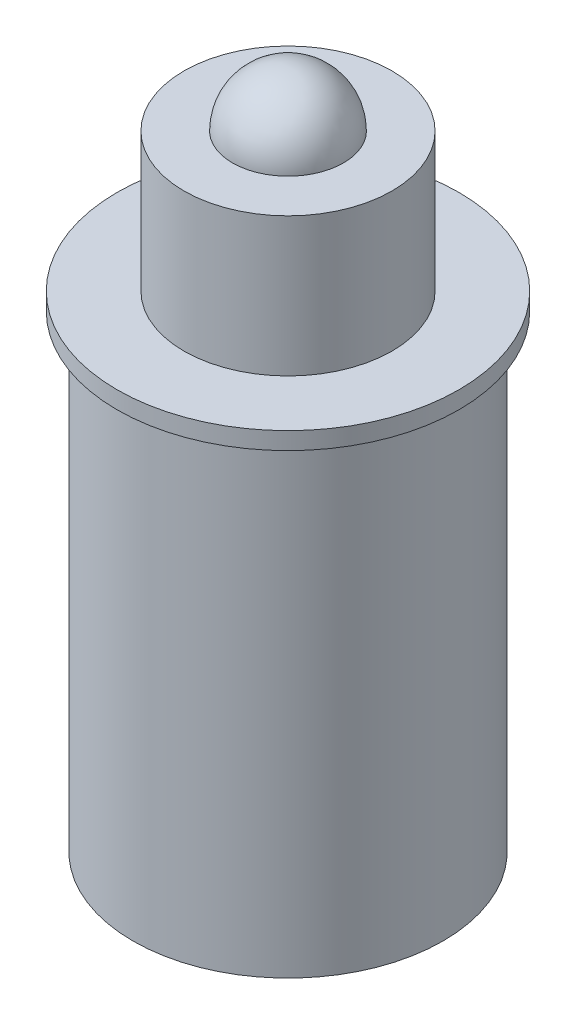
ISO-10303-21;
HEADER;
FILE_DESCRIPTION(('STEP AP214'),'2;1');
FILE_NAME('part.step','',(''),(''),'','','');
FILE_SCHEMA(('AUTOMOTIVE_DESIGN { 1 0 10303 214 1 1 1 1 }'));
ENDSEC;
DATA;
#1=APPLICATION_CONTEXT('core data for automotive mechanical design processes');
#2=APPLICATION_PROTOCOL_DEFINITION('international standard','automotive_design',2000,#1);
#3=PRODUCT_CONTEXT('',#1,'mechanical');
#4=PRODUCT('Part','Part','',(#3));
#5=PRODUCT_RELATED_PRODUCT_CATEGORY('part','',(#4));
#6=PRODUCT_DEFINITION_FORMATION('','',#4);
#7=PRODUCT_DEFINITION_CONTEXT('part definition',#1,'design');
#8=PRODUCT_DEFINITION('design','',#6,#7);
#9=PRODUCT_DEFINITION_SHAPE('','',#8);
#10=(LENGTH_UNIT() NAMED_UNIT(*) SI_UNIT(.MILLI.,.METRE.));
#11=(NAMED_UNIT(*) PLANE_ANGLE_UNIT() SI_UNIT($,.RADIAN.));
#12=(NAMED_UNIT(*) SI_UNIT($,.STERADIAN.) SOLID_ANGLE_UNIT());
#13=UNCERTAINTY_MEASURE_WITH_UNIT(LENGTH_MEASURE(1.E-05),#10,'distance_accuracy_value','');
#14=(GEOMETRIC_REPRESENTATION_CONTEXT(3) GLOBAL_UNCERTAINTY_ASSIGNED_CONTEXT((#13)) GLOBAL_UNIT_ASSIGNED_CONTEXT((#10,
#11,#12)) REPRESENTATION_CONTEXT('',''));
#15=CARTESIAN_POINT('',(0.,0.,0.));
#16=DIRECTION('',(0.,0.,1.));
#17=DIRECTION('',(1.,0.,0.));
#18=AXIS2_PLACEMENT_3D('',#15,#16,#17);
#19=CARTESIAN_POINT('',(0.,6.75,0.));
#20=DIRECTION('',(0.,-1.,0.));
#21=DIRECTION('',(0.,0.,-1.));
#22=AXIS2_PLACEMENT_3D('',#19,#20,#21);
#23=CYLINDRICAL_SURFACE('',#22,2.235);
#24=CARTESIAN_POINT('',(0.,6.75,0.));
#25=DIRECTION('',(0.,1.,0.));
#26=DIRECTION('',(0.,0.,1.));
#27=AXIS2_PLACEMENT_3D('',#24,#25,#26);
#28=CIRCLE('',#27,2.235);
#29=CARTESIAN_POINT('',(0.,6.75,2.235));
#30=VERTEX_POINT('',#29);
#31=EDGE_CURVE('E54',#30,#30,#28,.T.);
#32=ORIENTED_EDGE('',*,*,#31,.F.);
#33=EDGE_LOOP('',(#32));
#34=FACE_BOUND('',#33,.T.);
#35=CARTESIAN_POINT('',(0.,0.,0.));
#36=DIRECTION('',(0.,1.,0.));
#37=DIRECTION('',(0.,0.,1.));
#38=AXIS2_PLACEMENT_3D('',#35,#36,#37);
#39=CIRCLE('',#38,2.235);
#40=CARTESIAN_POINT('',(0.,0.,2.235));
#41=VERTEX_POINT('',#40);
#42=EDGE_CURVE('E43',#41,#41,#39,.T.);
#43=ORIENTED_EDGE('',*,*,#42,.T.);
#44=EDGE_LOOP('',(#43));
#45=FACE_BOUND('',#44,.T.);
#46=ADVANCED_FACE('F39',(#34,#45),#23,.T.);
#47=CARTESIAN_POINT('',(0.,0.,0.));
#48=DIRECTION('',(0.,1.,0.));
#49=DIRECTION('',(0.,0.,1.));
#50=AXIS2_PLACEMENT_3D('',#47,#48,#49);
#51=PLANE('',#50);
#52=ORIENTED_EDGE('',*,*,#42,.F.);
#53=EDGE_LOOP('',(#52));
#54=FACE_BOUND('',#53,.T.);
#55=ADVANCED_FACE('F77',(#54),#51,.F.);
#56=CARTESIAN_POINT('',(0.,7.,0.));
#57=DIRECTION('',(0.,-1.,0.));
#58=DIRECTION('',(0.,0.,-1.));
#59=AXIS2_PLACEMENT_3D('',#56,#57,#58);
#60=CYLINDRICAL_SURFACE('',#59,2.465);
#61=CARTESIAN_POINT('',(0.,7.,0.));
#62=DIRECTION('',(0.,1.,0.));
#63=DIRECTION('',(0.,0.,1.));
#64=AXIS2_PLACEMENT_3D('',#61,#62,#63);
#65=CIRCLE('',#64,2.465);
#66=CARTESIAN_POINT('',(0.,7.,2.465));
#67=VERTEX_POINT('',#66);
#68=EDGE_CURVE('E62',#67,#67,#65,.T.);
#69=ORIENTED_EDGE('',*,*,#68,.F.);
#70=EDGE_LOOP('',(#69));
#71=FACE_BOUND('',#70,.T.);
#72=CARTESIAN_POINT('',(0.,6.75,0.));
#73=DIRECTION('',(0.,1.,0.));
#74=DIRECTION('',(0.,0.,1.));
#75=AXIS2_PLACEMENT_3D('',#72,#73,#74);
#76=CIRCLE('',#75,2.465);
#77=CARTESIAN_POINT('',(0.,6.75,2.465));
#78=VERTEX_POINT('',#77);
#79=EDGE_CURVE('E60',#78,#78,#76,.T.);
#80=ORIENTED_EDGE('',*,*,#79,.T.);
#81=EDGE_LOOP('',(#80));
#82=FACE_BOUND('',#81,.T.);
#83=ADVANCED_FACE('F79',(#71,#82),#60,.T.);
#84=CARTESIAN_POINT('',(0.,7.,0.));
#85=DIRECTION('',(0.,1.,0.));
#86=DIRECTION('',(0.,0.,1.));
#87=AXIS2_PLACEMENT_3D('',#84,#85,#86);
#88=PLANE('',#87);
#89=CARTESIAN_POINT('',(0.,7.,0.));
#90=DIRECTION('',(0.,1.,0.));
#91=DIRECTION('',(0.,0.,1.));
#92=AXIS2_PLACEMENT_3D('',#89,#90,#91);
#93=CIRCLE('',#92,1.5);
#94=CARTESIAN_POINT('',(0.,7.,1.5));
#95=VERTEX_POINT('',#94);
#96=EDGE_CURVE('E48',#95,#95,#93,.T.);
#97=ORIENTED_EDGE('',*,*,#96,.F.);
#98=EDGE_LOOP('',(#97));
#99=FACE_BOUND('',#98,.T.);
#100=ORIENTED_EDGE('',*,*,#68,.T.);
#101=EDGE_LOOP('',(#100));
#102=FACE_BOUND('',#101,.T.);
#103=ADVANCED_FACE('F85',(#99,#102),#88,.T.);
#104=CARTESIAN_POINT('',(0.,6.75,0.));
#105=DIRECTION('',(0.,1.,0.));
#106=DIRECTION('',(0.,0.,1.));
#107=AXIS2_PLACEMENT_3D('',#104,#105,#106);
#108=PLANE('',#107);
#109=ORIENTED_EDGE('',*,*,#31,.T.);
#110=EDGE_LOOP('',(#109));
#111=FACE_BOUND('',#110,.T.);
#112=ORIENTED_EDGE('',*,*,#79,.F.);
#113=EDGE_LOOP('',(#112));
#114=FACE_BOUND('',#113,.T.);
#115=ADVANCED_FACE('F90',(#111,#114),#108,.F.);
#116=CARTESIAN_POINT('',(0.,9.,0.));
#117=DIRECTION('',(0.,-1.,0.));
#118=DIRECTION('',(0.,0.,-1.));
#119=AXIS2_PLACEMENT_3D('',#116,#117,#118);
#120=CYLINDRICAL_SURFACE('',#119,1.5);
#121=CARTESIAN_POINT('',(0.,9.,0.));
#122=DIRECTION('',(0.,1.,0.));
#123=DIRECTION('',(0.,0.,1.));
#124=AXIS2_PLACEMENT_3D('',#121,#122,#123);
#125=CIRCLE('',#124,1.5);
#126=CARTESIAN_POINT('',(0.,9.,1.5));
#127=VERTEX_POINT('',#126);
#128=EDGE_CURVE('E57',#127,#127,#125,.T.);
#129=ORIENTED_EDGE('',*,*,#128,.F.);
#130=EDGE_LOOP('',(#129));
#131=FACE_BOUND('',#130,.T.);
#132=ORIENTED_EDGE('',*,*,#96,.T.);
#133=EDGE_LOOP('',(#132));
#134=FACE_BOUND('',#133,.T.);
#135=ADVANCED_FACE('F93',(#131,#134),#120,.T.);
#136=CARTESIAN_POINT('',(0.,9.,0.));
#137=DIRECTION('',(0.,1.,0.));
#138=DIRECTION('',(0.,0.,1.));
#139=AXIS2_PLACEMENT_3D('',#136,#137,#138);
#140=PLANE('',#139);
#141=CARTESIAN_POINT('',(0.,9.,0.));
#142=DIRECTION('',(0.,1.,0.));
#143=DIRECTION('',(0.,0.,1.));
#144=AXIS2_PLACEMENT_3D('',#141,#142,#143);
#145=CIRCLE('',#144,0.8);
#146=CARTESIAN_POINT('',(0.,9.,0.8));
#147=VERTEX_POINT('',#146);
#148=EDGE_CURVE('E10',#147,#147,#145,.T.);
#149=ORIENTED_EDGE('',*,*,#148,.F.);
#150=EDGE_LOOP('',(#149));
#151=FACE_BOUND('',#150,.T.);
#152=ORIENTED_EDGE('',*,*,#128,.T.);
#153=EDGE_LOOP('',(#152));
#154=FACE_BOUND('',#153,.T.);
#155=ADVANCED_FACE('F99',(#151,#154),#140,.T.);
#156=CARTESIAN_POINT('',(0.,9.,0.));
#157=DIRECTION('',(0.,1.,0.));
#158=DIRECTION('',(0.,0.,1.));
#159=AXIS2_PLACEMENT_3D('',#156,#157,#158);
#160=SPHERICAL_SURFACE('',#159,0.8);
#161=ORIENTED_EDGE('',*,*,#148,.T.);
#162=EDGE_LOOP('',(#161));
#163=FACE_BOUND('',#162,.T.);
#164=ADVANCED_FACE('F41',(#163),#160,.T.);
#165=CLOSED_SHELL('',(#46,#55,#83,#103,#115,#135,#155,#164));
#166=MANIFOLD_SOLID_BREP('B2',#165);
#167=ADVANCED_BREP_SHAPE_REPRESENTATION('',(#18,#166),#14);
#168=SHAPE_DEFINITION_REPRESENTATION(#9,#167);
ENDSEC;
END-ISO-10303-21;
